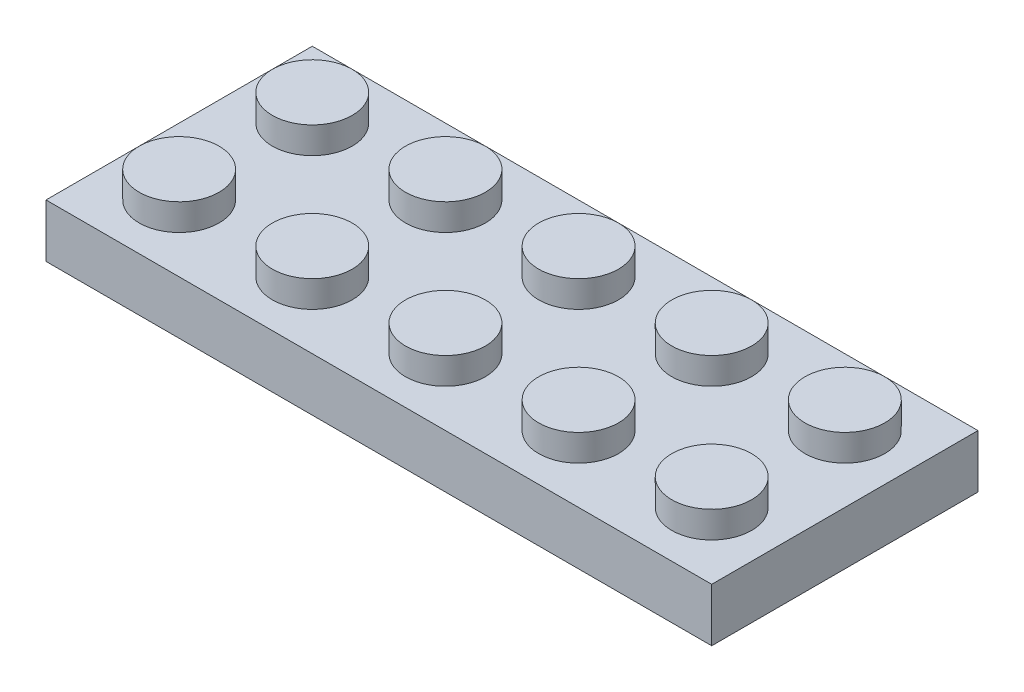
ISO-10303-21;
HEADER;
FILE_DESCRIPTION(('STEP AP214'),'2;1');
FILE_NAME('part.step','',(''),(''),'','','');
FILE_SCHEMA(('AUTOMOTIVE_DESIGN { 1 0 10303 214 1 1 1 1 }'));
ENDSEC;
DATA;
#1=APPLICATION_CONTEXT('core data for automotive mechanical design processes');
#2=APPLICATION_PROTOCOL_DEFINITION('international standard','automotive_design',2000,#1);
#3=PRODUCT_CONTEXT('',#1,'mechanical');
#4=PRODUCT('Part','Part','',(#3));
#5=PRODUCT_RELATED_PRODUCT_CATEGORY('part','',(#4));
#6=PRODUCT_DEFINITION_FORMATION('','',#4);
#7=PRODUCT_DEFINITION_CONTEXT('part definition',#1,'design');
#8=PRODUCT_DEFINITION('design','',#6,#7);
#9=PRODUCT_DEFINITION_SHAPE('','',#8);
#10=(LENGTH_UNIT() NAMED_UNIT(*) SI_UNIT(.MILLI.,.METRE.));
#11=(NAMED_UNIT(*) PLANE_ANGLE_UNIT() SI_UNIT($,.RADIAN.));
#12=(NAMED_UNIT(*) SI_UNIT($,.STERADIAN.) SOLID_ANGLE_UNIT());
#13=UNCERTAINTY_MEASURE_WITH_UNIT(LENGTH_MEASURE(1.E-05),#10,'distance_accuracy_value','');
#14=(GEOMETRIC_REPRESENTATION_CONTEXT(3) GLOBAL_UNCERTAINTY_ASSIGNED_CONTEXT((#13)) GLOBAL_UNIT_ASSIGNED_CONTEXT((#10,
#11,#12)) REPRESENTATION_CONTEXT('',''));
#15=CARTESIAN_POINT('',(0.,0.,0.));
#16=DIRECTION('',(0.,0.,1.));
#17=DIRECTION('',(1.,0.,0.));
#18=AXIS2_PLACEMENT_3D('',#15,#16,#17);
#19=CARTESIAN_POINT('',(36.,1.6,4.));
#20=DIRECTION('',(-1.,0.,0.));
#21=DIRECTION('',(0.,0.,1.));
#22=AXIS2_PLACEMENT_3D('',#19,#20,#21);
#23=PLANE('',#22);
#24=DIRECTION('',(0.,0.,-1.));
#25=VECTOR('',#24,1.);
#26=CARTESIAN_POINT('',(36.,0.,4.));
#27=LINE('',#26,#25);
#28=CARTESIAN_POINT('',(36.,0.,12.));
#29=VERTEX_POINT('',#28);
#30=CARTESIAN_POINT('',(36.,0.,-4.));
#31=VERTEX_POINT('',#30);
#32=EDGE_CURVE('E189',#29,#31,#27,.T.);
#33=ORIENTED_EDGE('',*,*,#32,.T.);
#34=DIRECTION('',(0.,-1.,0.));
#35=VECTOR('',#34,1.);
#36=CARTESIAN_POINT('',(36.,1.6,-4.));
#37=LINE('',#36,#35);
#38=CARTESIAN_POINT('',(36.,3.2,-4.));
#39=VERTEX_POINT('',#38);
#40=EDGE_CURVE('E243',#39,#31,#37,.T.);
#41=ORIENTED_EDGE('',*,*,#40,.F.);
#42=DIRECTION('',(0.,0.,-1.));
#43=VECTOR('',#42,1.);
#44=CARTESIAN_POINT('',(36.,3.2,4.));
#45=LINE('',#44,#43);
#46=CARTESIAN_POINT('',(36.,3.2,12.));
#47=VERTEX_POINT('',#46);
#48=EDGE_CURVE('E11',#47,#39,#45,.T.);
#49=ORIENTED_EDGE('',*,*,#48,.F.);
#50=DIRECTION('',(0.,1.,0.));
#51=VECTOR('',#50,1.);
#52=CARTESIAN_POINT('',(36.,1.6,12.));
#53=LINE('',#52,#51);
#54=EDGE_CURVE('E237',#29,#47,#53,.T.);
#55=ORIENTED_EDGE('',*,*,#54,.F.);
#56=EDGE_LOOP('',(#33,#41,#49,#55));
#57=FACE_BOUND('',#56,.T.);
#58=ADVANCED_FACE('F17',(#57),#23,.F.);
#59=CARTESIAN_POINT('',(16.,3.2,4.));
#60=DIRECTION('',(0.,-1.,0.));
#61=DIRECTION('',(0.,0.,-1.));
#62=AXIS2_PLACEMENT_3D('',#59,#60,#61);
#63=PLANE('',#62);
#64=ORIENTED_EDGE('',*,*,#48,.T.);
#65=DIRECTION('',(1.,0.,0.));
#66=VECTOR('',#65,1.);
#67=CARTESIAN_POINT('',(16.,3.2,-4.));
#68=LINE('',#67,#66);
#69=CARTESIAN_POINT('',(-4.,3.2,-4.));
#70=VERTEX_POINT('',#69);
#71=EDGE_CURVE('E190',#70,#39,#68,.T.);
#72=ORIENTED_EDGE('',*,*,#71,.F.);
#73=DIRECTION('',(0.,0.,-1.));
#74=VECTOR('',#73,1.);
#75=CARTESIAN_POINT('',(-4.,3.2,4.));
#76=LINE('',#75,#74);
#77=CARTESIAN_POINT('',(-4.,3.2,12.));
#78=VERTEX_POINT('',#77);
#79=EDGE_CURVE('E27',#78,#70,#76,.T.);
#80=ORIENTED_EDGE('',*,*,#79,.F.);
#81=DIRECTION('',(-1.,0.,0.));
#82=VECTOR('',#81,1.);
#83=CARTESIAN_POINT('',(16.,3.2,12.));
#84=LINE('',#83,#82);
#85=EDGE_CURVE('E275',#47,#78,#84,.T.);
#86=ORIENTED_EDGE('',*,*,#85,.F.);
#87=EDGE_LOOP('',(#64,#72,#80,#86));
#88=FACE_BOUND('',#87,.T.);
#89=CARTESIAN_POINT('',(0.,3.2,0.));
#90=DIRECTION('',(0.,-1.,0.));
#91=DIRECTION('',(1.,0.,0.));
#92=AXIS2_PLACEMENT_3D('',#89,#90,#91);
#93=CIRCLE('',#92,2.4);
#94=CARTESIAN_POINT('',(-2.4,3.2,0.));
#95=VERTEX_POINT('',#94);
#96=EDGE_CURVE('E185',#95,#95,#93,.T.);
#97=ORIENTED_EDGE('',*,*,#96,.T.);
#98=EDGE_LOOP('',(#97));
#99=FACE_BOUND('',#98,.T.);
#100=CARTESIAN_POINT('',(0.,3.2,8.));
#101=DIRECTION('',(0.,-1.,0.));
#102=DIRECTION('',(1.,0.,0.));
#103=AXIS2_PLACEMENT_3D('',#100,#101,#102);
#104=CIRCLE('',#103,2.4);
#105=CARTESIAN_POINT('',(-2.4,3.2,8.));
#106=VERTEX_POINT('',#105);
#107=EDGE_CURVE('E186',#106,#106,#104,.T.);
#108=ORIENTED_EDGE('',*,*,#107,.T.);
#109=EDGE_LOOP('',(#108));
#110=FACE_BOUND('',#109,.T.);
#111=CARTESIAN_POINT('',(8.,3.2,0.));
#112=DIRECTION('',(0.,-1.,0.));
#113=DIRECTION('',(1.,0.,0.));
#114=AXIS2_PLACEMENT_3D('',#111,#112,#113);
#115=CIRCLE('',#114,2.4);
#116=CARTESIAN_POINT('',(5.6,3.2,0.));
#117=VERTEX_POINT('',#116);
#118=EDGE_CURVE('E221',#117,#117,#115,.T.);
#119=ORIENTED_EDGE('',*,*,#118,.T.);
#120=EDGE_LOOP('',(#119));
#121=FACE_BOUND('',#120,.T.);
#122=CARTESIAN_POINT('',(8.,3.2,8.));
#123=DIRECTION('',(0.,-1.,0.));
#124=DIRECTION('',(1.,0.,0.));
#125=AXIS2_PLACEMENT_3D('',#122,#123,#124);
#126=CIRCLE('',#125,2.4);
#127=CARTESIAN_POINT('',(5.6,3.2,8.));
#128=VERTEX_POINT('',#127);
#129=EDGE_CURVE('E227',#128,#128,#126,.T.);
#130=ORIENTED_EDGE('',*,*,#129,.T.);
#131=EDGE_LOOP('',(#130));
#132=FACE_BOUND('',#131,.T.);
#133=CARTESIAN_POINT('',(16.,3.2,0.));
#134=DIRECTION('',(0.,-1.,0.));
#135=DIRECTION('',(1.,0.,0.));
#136=AXIS2_PLACEMENT_3D('',#133,#134,#135);
#137=CIRCLE('',#136,2.4);
#138=CARTESIAN_POINT('',(13.6,3.2,0.));
#139=VERTEX_POINT('',#138);
#140=EDGE_CURVE('E171',#139,#139,#137,.T.);
#141=ORIENTED_EDGE('',*,*,#140,.T.);
#142=EDGE_LOOP('',(#141));
#143=FACE_BOUND('',#142,.T.);
#144=CARTESIAN_POINT('',(16.,3.2,8.));
#145=DIRECTION('',(0.,-1.,0.));
#146=DIRECTION('',(1.,0.,0.));
#147=AXIS2_PLACEMENT_3D('',#144,#145,#146);
#148=CIRCLE('',#147,2.4);
#149=CARTESIAN_POINT('',(13.6,3.2,8.));
#150=VERTEX_POINT('',#149);
#151=EDGE_CURVE('E164',#150,#150,#148,.T.);
#152=ORIENTED_EDGE('',*,*,#151,.T.);
#153=EDGE_LOOP('',(#152));
#154=FACE_BOUND('',#153,.T.);
#155=CARTESIAN_POINT('',(24.,3.2,0.));
#156=DIRECTION('',(0.,-1.,0.));
#157=DIRECTION('',(1.,0.,0.));
#158=AXIS2_PLACEMENT_3D('',#155,#156,#157);
#159=CIRCLE('',#158,2.4);
#160=CARTESIAN_POINT('',(21.6,3.2,0.));
#161=VERTEX_POINT('',#160);
#162=EDGE_CURVE('E173',#161,#161,#159,.T.);
#163=ORIENTED_EDGE('',*,*,#162,.T.);
#164=EDGE_LOOP('',(#163));
#165=FACE_BOUND('',#164,.T.);
#166=CARTESIAN_POINT('',(24.,3.2,8.));
#167=DIRECTION('',(0.,-1.,0.));
#168=DIRECTION('',(1.,0.,0.));
#169=AXIS2_PLACEMENT_3D('',#166,#167,#168);
#170=CIRCLE('',#169,2.4);
#171=CARTESIAN_POINT('',(21.6,3.2,8.));
#172=VERTEX_POINT('',#171);
#173=EDGE_CURVE('E249',#172,#172,#170,.T.);
#174=ORIENTED_EDGE('',*,*,#173,.T.);
#175=EDGE_LOOP('',(#174));
#176=FACE_BOUND('',#175,.T.);
#177=CARTESIAN_POINT('',(32.,3.2,0.));
#178=DIRECTION('',(0.,-1.,0.));
#179=DIRECTION('',(1.,0.,0.));
#180=AXIS2_PLACEMENT_3D('',#177,#178,#179);
#181=CIRCLE('',#180,2.4);
#182=CARTESIAN_POINT('',(29.6,3.2,0.));
#183=VERTEX_POINT('',#182);
#184=EDGE_CURVE('E292',#183,#183,#181,.T.);
#185=ORIENTED_EDGE('',*,*,#184,.T.);
#186=EDGE_LOOP('',(#185));
#187=FACE_BOUND('',#186,.T.);
#188=CARTESIAN_POINT('',(32.,3.2,8.));
#189=DIRECTION('',(0.,-1.,0.));
#190=DIRECTION('',(1.,0.,0.));
#191=AXIS2_PLACEMENT_3D('',#188,#189,#190);
#192=CIRCLE('',#191,2.4);
#193=CARTESIAN_POINT('',(29.6,3.2,8.));
#194=VERTEX_POINT('',#193);
#195=EDGE_CURVE('E201',#194,#194,#192,.T.);
#196=ORIENTED_EDGE('',*,*,#195,.T.);
#197=EDGE_LOOP('',(#196));
#198=FACE_BOUND('',#197,.T.);
#199=ADVANCED_FACE('F165',(#88,#99,#110,#121,#132,#143,#154,#165,#176,#187,#198),#63,.F.);
#200=CARTESIAN_POINT('',(-4.,1.6,4.));
#201=DIRECTION('',(1.,0.,0.));
#202=DIRECTION('',(0.,0.,-1.));
#203=AXIS2_PLACEMENT_3D('',#200,#201,#202);
#204=PLANE('',#203);
#205=ORIENTED_EDGE('',*,*,#79,.T.);
#206=DIRECTION('',(0.,1.,0.));
#207=VECTOR('',#206,1.);
#208=CARTESIAN_POINT('',(-4.,1.6,-4.));
#209=LINE('',#208,#207);
#210=CARTESIAN_POINT('',(-4.,0.,-4.));
#211=VERTEX_POINT('',#210);
#212=EDGE_CURVE('E208',#211,#70,#209,.T.);
#213=ORIENTED_EDGE('',*,*,#212,.F.);
#214=DIRECTION('',(0.,0.,-1.));
#215=VECTOR('',#214,1.);
#216=CARTESIAN_POINT('',(-4.,0.,4.));
#217=LINE('',#216,#215);
#218=CARTESIAN_POINT('',(-4.,0.,12.));
#219=VERTEX_POINT('',#218);
#220=EDGE_CURVE('E187',#219,#211,#217,.T.);
#221=ORIENTED_EDGE('',*,*,#220,.F.);
#222=DIRECTION('',(0.,-1.,0.));
#223=VECTOR('',#222,1.);
#224=CARTESIAN_POINT('',(-4.,1.6,12.));
#225=LINE('',#224,#223);
#226=EDGE_CURVE('E248',#78,#219,#225,.T.);
#227=ORIENTED_EDGE('',*,*,#226,.F.);
#228=EDGE_LOOP('',(#205,#213,#221,#227));
#229=FACE_BOUND('',#228,.T.);
#230=ADVANCED_FACE('F339',(#229),#204,.F.);
#231=CARTESIAN_POINT('',(16.,0.,4.));
#232=DIRECTION('',(0.,1.,0.));
#233=DIRECTION('',(0.,0.,1.));
#234=AXIS2_PLACEMENT_3D('',#231,#232,#233);
#235=PLANE('',#234);
#236=ORIENTED_EDGE('',*,*,#220,.T.);
#237=DIRECTION('',(-1.,0.,0.));
#238=VECTOR('',#237,1.);
#239=CARTESIAN_POINT('',(16.,0.,-4.));
#240=LINE('',#239,#238);
#241=EDGE_CURVE('E240',#31,#211,#240,.T.);
#242=ORIENTED_EDGE('',*,*,#241,.F.);
#243=ORIENTED_EDGE('',*,*,#32,.F.);
#244=DIRECTION('',(1.,0.,0.));
#245=VECTOR('',#244,1.);
#246=CARTESIAN_POINT('',(16.,0.,12.));
#247=LINE('',#246,#245);
#248=EDGE_CURVE('E245',#219,#29,#247,.T.);
#249=ORIENTED_EDGE('',*,*,#248,.F.);
#250=EDGE_LOOP('',(#236,#242,#243,#249));
#251=FACE_BOUND('',#250,.T.);
#252=CARTESIAN_POINT('',(0.,0.,0.));
#253=DIRECTION('',(0.,1.,0.));
#254=DIRECTION('',(1.,0.,0.));
#255=AXIS2_PLACEMENT_3D('',#252,#253,#254);
#256=CIRCLE('',#255,2.4);
#257=CARTESIAN_POINT('',(-2.4,0.,0.));
#258=VERTEX_POINT('',#257);
#259=EDGE_CURVE('E256',#258,#258,#256,.T.);
#260=ORIENTED_EDGE('',*,*,#259,.T.);
#261=EDGE_LOOP('',(#260));
#262=FACE_BOUND('',#261,.T.);
#263=CARTESIAN_POINT('',(0.,0.,8.));
#264=DIRECTION('',(0.,1.,0.));
#265=DIRECTION('',(1.,0.,0.));
#266=AXIS2_PLACEMENT_3D('',#263,#264,#265);
#267=CIRCLE('',#266,2.4);
#268=CARTESIAN_POINT('',(-2.4,0.,8.));
#269=VERTEX_POINT('',#268);
#270=EDGE_CURVE('E257',#269,#269,#267,.T.);
#271=ORIENTED_EDGE('',*,*,#270,.T.);
#272=EDGE_LOOP('',(#271));
#273=FACE_BOUND('',#272,.T.);
#274=CARTESIAN_POINT('',(8.,0.,0.));
#275=DIRECTION('',(0.,1.,0.));
#276=DIRECTION('',(1.,0.,0.));
#277=AXIS2_PLACEMENT_3D('',#274,#275,#276);
#278=CIRCLE('',#277,2.4);
#279=CARTESIAN_POINT('',(5.6,0.,0.));
#280=VERTEX_POINT('',#279);
#281=EDGE_CURVE('E269',#280,#280,#278,.T.);
#282=ORIENTED_EDGE('',*,*,#281,.T.);
#283=EDGE_LOOP('',(#282));
#284=FACE_BOUND('',#283,.T.);
#285=CARTESIAN_POINT('',(8.,0.,8.));
#286=DIRECTION('',(0.,1.,0.));
#287=DIRECTION('',(1.,0.,0.));
#288=AXIS2_PLACEMENT_3D('',#285,#286,#287);
#289=CIRCLE('',#288,2.4);
#290=CARTESIAN_POINT('',(5.6,0.,8.));
#291=VERTEX_POINT('',#290);
#292=EDGE_CURVE('E270',#291,#291,#289,.T.);
#293=ORIENTED_EDGE('',*,*,#292,.T.);
#294=EDGE_LOOP('',(#293));
#295=FACE_BOUND('',#294,.T.);
#296=CARTESIAN_POINT('',(16.,0.,0.));
#297=DIRECTION('',(0.,1.,0.));
#298=DIRECTION('',(1.,0.,0.));
#299=AXIS2_PLACEMENT_3D('',#296,#297,#298);
#300=CIRCLE('',#299,2.4);
#301=CARTESIAN_POINT('',(13.6,0.,0.));
#302=VERTEX_POINT('',#301);
#303=EDGE_CURVE('E219',#302,#302,#300,.T.);
#304=ORIENTED_EDGE('',*,*,#303,.T.);
#305=EDGE_LOOP('',(#304));
#306=FACE_BOUND('',#305,.T.);
#307=CARTESIAN_POINT('',(16.,0.,8.));
#308=DIRECTION('',(0.,1.,0.));
#309=DIRECTION('',(1.,0.,0.));
#310=AXIS2_PLACEMENT_3D('',#307,#308,#309);
#311=CIRCLE('',#310,2.4);
#312=CARTESIAN_POINT('',(13.6,0.,8.));
#313=VERTEX_POINT('',#312);
#314=EDGE_CURVE('E220',#313,#313,#311,.T.);
#315=ORIENTED_EDGE('',*,*,#314,.T.);
#316=EDGE_LOOP('',(#315));
#317=FACE_BOUND('',#316,.T.);
#318=CARTESIAN_POINT('',(24.,0.,0.));
#319=DIRECTION('',(0.,1.,0.));
#320=DIRECTION('',(1.,0.,0.));
#321=AXIS2_PLACEMENT_3D('',#318,#319,#320);
#322=CIRCLE('',#321,2.4);
#323=CARTESIAN_POINT('',(21.6,0.,0.));
#324=VERTEX_POINT('',#323);
#325=EDGE_CURVE('E197',#324,#324,#322,.T.);
#326=ORIENTED_EDGE('',*,*,#325,.T.);
#327=EDGE_LOOP('',(#326));
#328=FACE_BOUND('',#327,.T.);
#329=CARTESIAN_POINT('',(24.,0.,8.));
#330=DIRECTION('',(0.,1.,0.));
#331=DIRECTION('',(1.,0.,0.));
#332=AXIS2_PLACEMENT_3D('',#329,#330,#331);
#333=CIRCLE('',#332,2.4);
#334=CARTESIAN_POINT('',(21.6,0.,8.));
#335=VERTEX_POINT('',#334);
#336=EDGE_CURVE('E198',#335,#335,#333,.T.);
#337=ORIENTED_EDGE('',*,*,#336,.T.);
#338=EDGE_LOOP('',(#337));
#339=FACE_BOUND('',#338,.T.);
#340=CARTESIAN_POINT('',(32.,0.,0.));
#341=DIRECTION('',(0.,1.,0.));
#342=DIRECTION('',(1.,0.,0.));
#343=AXIS2_PLACEMENT_3D('',#340,#341,#342);
#344=CIRCLE('',#343,2.4);
#345=CARTESIAN_POINT('',(29.6,0.,0.));
#346=VERTEX_POINT('',#345);
#347=EDGE_CURVE('E279',#346,#346,#344,.T.);
#348=ORIENTED_EDGE('',*,*,#347,.T.);
#349=EDGE_LOOP('',(#348));
#350=FACE_BOUND('',#349,.T.);
#351=CARTESIAN_POINT('',(32.,0.,8.));
#352=DIRECTION('',(0.,1.,0.));
#353=DIRECTION('',(1.,0.,0.));
#354=AXIS2_PLACEMENT_3D('',#351,#352,#353);
#355=CIRCLE('',#354,2.4);
#356=CARTESIAN_POINT('',(29.6,0.,8.));
#357=VERTEX_POINT('',#356);
#358=EDGE_CURVE('E193',#357,#357,#355,.T.);
#359=ORIENTED_EDGE('',*,*,#358,.T.);
#360=EDGE_LOOP('',(#359));
#361=FACE_BOUND('',#360,.T.);
#362=CARTESIAN_POINT('',(4.,0.,4.));
#363=DIRECTION('',(0.,1.,0.));
#364=DIRECTION('',(1.,0.,0.));
#365=AXIS2_PLACEMENT_3D('',#362,#363,#364);
#366=CIRCLE('',#365,2.4);
#367=CARTESIAN_POINT('',(1.6,0.,4.));
#368=VERTEX_POINT('',#367);
#369=EDGE_CURVE('E194',#368,#368,#366,.T.);
#370=ORIENTED_EDGE('',*,*,#369,.T.);
#371=EDGE_LOOP('',(#370));
#372=FACE_BOUND('',#371,.T.);
#373=CARTESIAN_POINT('',(12.,0.,4.));
#374=DIRECTION('',(0.,1.,0.));
#375=DIRECTION('',(1.,0.,0.));
#376=AXIS2_PLACEMENT_3D('',#373,#374,#375);
#377=CIRCLE('',#376,2.4);
#378=CARTESIAN_POINT('',(9.6,0.,4.));
#379=VERTEX_POINT('',#378);
#380=EDGE_CURVE('E181',#379,#379,#377,.T.);
#381=ORIENTED_EDGE('',*,*,#380,.T.);
#382=EDGE_LOOP('',(#381));
#383=FACE_BOUND('',#382,.T.);
#384=CARTESIAN_POINT('',(20.,0.,4.));
#385=DIRECTION('',(0.,1.,0.));
#386=DIRECTION('',(1.,0.,0.));
#387=AXIS2_PLACEMENT_3D('',#384,#385,#386);
#388=CIRCLE('',#387,2.4);
#389=CARTESIAN_POINT('',(17.6,0.,4.));
#390=VERTEX_POINT('',#389);
#391=EDGE_CURVE('E182',#390,#390,#388,.T.);
#392=ORIENTED_EDGE('',*,*,#391,.T.);
#393=EDGE_LOOP('',(#392));
#394=FACE_BOUND('',#393,.T.);
#395=CARTESIAN_POINT('',(28.,0.,4.));
#396=DIRECTION('',(0.,1.,0.));
#397=DIRECTION('',(1.,0.,0.));
#398=AXIS2_PLACEMENT_3D('',#395,#396,#397);
#399=CIRCLE('',#398,2.4);
#400=CARTESIAN_POINT('',(25.6,0.,4.));
#401=VERTEX_POINT('',#400);
#402=EDGE_CURVE('E205',#401,#401,#399,.T.);
#403=ORIENTED_EDGE('',*,*,#402,.T.);
#404=EDGE_LOOP('',(#403));
#405=FACE_BOUND('',#404,.T.);
#406=ADVANCED_FACE('F389',(#251,#262,#273,#284,#295,#306,#317,#328,#339,#350,#361,#372,#383,
#394,#405),#235,.F.);
#407=CARTESIAN_POINT('',(16.,1.6,-4.));
#408=DIRECTION('',(0.,0.,1.));
#409=DIRECTION('',(1.,0.,0.));
#410=AXIS2_PLACEMENT_3D('',#407,#408,#409);
#411=PLANE('',#410);
#412=ORIENTED_EDGE('',*,*,#40,.T.);
#413=ORIENTED_EDGE('',*,*,#241,.T.);
#414=ORIENTED_EDGE('',*,*,#212,.T.);
#415=ORIENTED_EDGE('',*,*,#71,.T.);
#416=EDGE_LOOP('',(#412,#413,#414,#415));
#417=FACE_BOUND('',#416,.T.);
#418=ADVANCED_FACE('F344',(#417),#411,.F.);
#419=CARTESIAN_POINT('',(16.,1.6,12.));
#420=DIRECTION('',(0.,0.,1.));
#421=DIRECTION('',(1.,0.,0.));
#422=AXIS2_PLACEMENT_3D('',#419,#420,#421);
#423=PLANE('',#422);
#424=ORIENTED_EDGE('',*,*,#54,.T.);
#425=ORIENTED_EDGE('',*,*,#85,.T.);
#426=ORIENTED_EDGE('',*,*,#226,.T.);
#427=ORIENTED_EDGE('',*,*,#248,.T.);
#428=EDGE_LOOP('',(#424,#425,#426,#427));
#429=FACE_BOUND('',#428,.T.);
#430=ADVANCED_FACE('F527',(#429),#423,.T.);
#431=CARTESIAN_POINT('',(0.,4.8,0.));
#432=DIRECTION('',(0.,1.,0.));
#433=DIRECTION('',(1.,0.,0.));
#434=AXIS2_PLACEMENT_3D('',#431,#432,#433);
#435=PLANE('',#434);
#436=CARTESIAN_POINT('',(0.,4.8,0.));
#437=DIRECTION('',(0.,1.,0.));
#438=DIRECTION('',(1.,0.,0.));
#439=AXIS2_PLACEMENT_3D('',#436,#437,#438);
#440=CIRCLE('',#439,2.4);
#441=CARTESIAN_POINT('',(2.4,4.8,0.));
#442=VERTEX_POINT('',#441);
#443=EDGE_CURVE('E183',#442,#442,#440,.T.);
#444=ORIENTED_EDGE('',*,*,#443,.T.);
#445=EDGE_LOOP('',(#444));
#446=FACE_BOUND('',#445,.T.);
#447=ADVANCED_FACE('F524',(#446),#435,.T.);
#448=CARTESIAN_POINT('',(0.,3.75,0.));
#449=DIRECTION('',(0.,-1.,0.));
#450=DIRECTION('',(1.,0.,0.));
#451=AXIS2_PLACEMENT_3D('',#448,#449,#450);
#452=CYLINDRICAL_SURFACE('',#451,2.4);
#453=ORIENTED_EDGE('',*,*,#96,.F.);
#454=EDGE_LOOP('',(#453));
#455=FACE_BOUND('',#454,.T.);
#456=ORIENTED_EDGE('',*,*,#443,.F.);
#457=EDGE_LOOP('',(#456));
#458=FACE_BOUND('',#457,.T.);
#459=ADVANCED_FACE('F328',(#455,#458),#452,.T.);
#460=CARTESIAN_POINT('',(0.,4.8,8.));
#461=DIRECTION('',(0.,1.,0.));
#462=DIRECTION('',(1.,0.,0.));
#463=AXIS2_PLACEMENT_3D('',#460,#461,#462);
#464=PLANE('',#463);
#465=CARTESIAN_POINT('',(0.,4.8,8.));
#466=DIRECTION('',(0.,1.,0.));
#467=DIRECTION('',(1.,0.,0.));
#468=AXIS2_PLACEMENT_3D('',#465,#466,#467);
#469=CIRCLE('',#468,2.4);
#470=CARTESIAN_POINT('',(2.4,4.8,8.));
#471=VERTEX_POINT('',#470);
#472=EDGE_CURVE('E210',#471,#471,#469,.T.);
#473=ORIENTED_EDGE('',*,*,#472,.T.);
#474=EDGE_LOOP('',(#473));
#475=FACE_BOUND('',#474,.T.);
#476=ADVANCED_FACE('F314',(#475),#464,.T.);
#477=CARTESIAN_POINT('',(0.,3.75,8.));
#478=DIRECTION('',(0.,-1.,0.));
#479=DIRECTION('',(1.,0.,0.));
#480=AXIS2_PLACEMENT_3D('',#477,#478,#479);
#481=CYLINDRICAL_SURFACE('',#480,2.4);
#482=ORIENTED_EDGE('',*,*,#107,.F.);
#483=EDGE_LOOP('',(#482));
#484=FACE_BOUND('',#483,.T.);
#485=ORIENTED_EDGE('',*,*,#472,.F.);
#486=EDGE_LOOP('',(#485));
#487=FACE_BOUND('',#486,.T.);
#488=ADVANCED_FACE('F316',(#484,#487),#481,.T.);
#489=CARTESIAN_POINT('',(8.,4.8,0.));
#490=DIRECTION('',(0.,1.,0.));
#491=DIRECTION('',(1.,0.,0.));
#492=AXIS2_PLACEMENT_3D('',#489,#490,#491);
#493=PLANE('',#492);
#494=CARTESIAN_POINT('',(8.,4.8,0.));
#495=DIRECTION('',(0.,1.,0.));
#496=DIRECTION('',(1.,0.,0.));
#497=AXIS2_PLACEMENT_3D('',#494,#495,#496);
#498=CIRCLE('',#497,2.4);
#499=CARTESIAN_POINT('',(10.4,4.8,0.));
#500=VERTEX_POINT('',#499);
#501=EDGE_CURVE('E223',#500,#500,#498,.T.);
#502=ORIENTED_EDGE('',*,*,#501,.T.);
#503=EDGE_LOOP('',(#502));
#504=FACE_BOUND('',#503,.T.);
#505=ADVANCED_FACE('F318',(#504),#493,.T.);
#506=CARTESIAN_POINT('',(8.,3.75,0.));
#507=DIRECTION('',(0.,-1.,0.));
#508=DIRECTION('',(1.,0.,0.));
#509=AXIS2_PLACEMENT_3D('',#506,#507,#508);
#510=CYLINDRICAL_SURFACE('',#509,2.4);
#511=ORIENTED_EDGE('',*,*,#118,.F.);
#512=EDGE_LOOP('',(#511));
#513=FACE_BOUND('',#512,.T.);
#514=ORIENTED_EDGE('',*,*,#501,.F.);
#515=EDGE_LOOP('',(#514));
#516=FACE_BOUND('',#515,.T.);
#517=ADVANCED_FACE('F326',(#513,#516),#510,.T.);
#518=CARTESIAN_POINT('',(8.,4.8,8.));
#519=DIRECTION('',(0.,1.,0.));
#520=DIRECTION('',(1.,0.,0.));
#521=AXIS2_PLACEMENT_3D('',#518,#519,#520);
#522=PLANE('',#521);
#523=CARTESIAN_POINT('',(8.,4.8,8.));
#524=DIRECTION('',(0.,1.,0.));
#525=DIRECTION('',(1.,0.,0.));
#526=AXIS2_PLACEMENT_3D('',#523,#524,#525);
#527=CIRCLE('',#526,2.4);
#528=CARTESIAN_POINT('',(10.4,4.8,8.));
#529=VERTEX_POINT('',#528);
#530=EDGE_CURVE('E230',#529,#529,#527,.T.);
#531=ORIENTED_EDGE('',*,*,#530,.T.);
#532=EDGE_LOOP('',(#531));
#533=FACE_BOUND('',#532,.T.);
#534=ADVANCED_FACE('F366',(#533),#522,.T.);
#535=CARTESIAN_POINT('',(8.,3.75,8.));
#536=DIRECTION('',(0.,-1.,0.));
#537=DIRECTION('',(1.,0.,0.));
#538=AXIS2_PLACEMENT_3D('',#535,#536,#537);
#539=CYLINDRICAL_SURFACE('',#538,2.4);
#540=ORIENTED_EDGE('',*,*,#129,.F.);
#541=EDGE_LOOP('',(#540));
#542=FACE_BOUND('',#541,.T.);
#543=ORIENTED_EDGE('',*,*,#530,.F.);
#544=EDGE_LOOP('',(#543));
#545=FACE_BOUND('',#544,.T.);
#546=ADVANCED_FACE('F362',(#542,#545),#539,.T.);
#547=CARTESIAN_POINT('',(16.,4.8,0.));
#548=DIRECTION('',(0.,1.,0.));
#549=DIRECTION('',(1.,0.,0.));
#550=AXIS2_PLACEMENT_3D('',#547,#548,#549);
#551=PLANE('',#550);
#552=CARTESIAN_POINT('',(16.,4.8,0.));
#553=DIRECTION('',(0.,1.,0.));
#554=DIRECTION('',(1.,0.,0.));
#555=AXIS2_PLACEMENT_3D('',#552,#553,#554);
#556=CIRCLE('',#555,2.4);
#557=CARTESIAN_POINT('',(18.4,4.8,0.));
#558=VERTEX_POINT('',#557);
#559=EDGE_CURVE('E168',#558,#558,#556,.T.);
#560=ORIENTED_EDGE('',*,*,#559,.T.);
#561=EDGE_LOOP('',(#560));
#562=FACE_BOUND('',#561,.T.);
#563=ADVANCED_FACE('F365',(#562),#551,.T.);
#564=CARTESIAN_POINT('',(16.,3.75,0.));
#565=DIRECTION('',(0.,-1.,0.));
#566=DIRECTION('',(1.,0.,0.));
#567=AXIS2_PLACEMENT_3D('',#564,#565,#566);
#568=CYLINDRICAL_SURFACE('',#567,2.4);
#569=ORIENTED_EDGE('',*,*,#140,.F.);
#570=EDGE_LOOP('',(#569));
#571=FACE_BOUND('',#570,.T.);
#572=ORIENTED_EDGE('',*,*,#559,.F.);
#573=EDGE_LOOP('',(#572));
#574=FACE_BOUND('',#573,.T.);
#575=ADVANCED_FACE('F516',(#571,#574),#568,.T.);
#576=CARTESIAN_POINT('',(16.,4.8,8.));
#577=DIRECTION('',(0.,1.,0.));
#578=DIRECTION('',(1.,0.,0.));
#579=AXIS2_PLACEMENT_3D('',#576,#577,#578);
#580=PLANE('',#579);
#581=CARTESIAN_POINT('',(16.,4.8,8.));
#582=DIRECTION('',(0.,1.,0.));
#583=DIRECTION('',(1.,0.,0.));
#584=AXIS2_PLACEMENT_3D('',#581,#582,#583);
#585=CIRCLE('',#584,2.4);
#586=CARTESIAN_POINT('',(18.4,4.8,8.));
#587=VERTEX_POINT('',#586);
#588=EDGE_CURVE('E169',#587,#587,#585,.T.);
#589=ORIENTED_EDGE('',*,*,#588,.T.);
#590=EDGE_LOOP('',(#589));
#591=FACE_BOUND('',#590,.T.);
#592=ADVANCED_FACE('F19',(#591),#580,.T.);
#593=CARTESIAN_POINT('',(16.,3.75,8.));
#594=DIRECTION('',(0.,-1.,0.));
#595=DIRECTION('',(1.,0.,0.));
#596=AXIS2_PLACEMENT_3D('',#593,#594,#595);
#597=CYLINDRICAL_SURFACE('',#596,2.4);
#598=ORIENTED_EDGE('',*,*,#151,.F.);
#599=EDGE_LOOP('',(#598));
#600=FACE_BOUND('',#599,.T.);
#601=ORIENTED_EDGE('',*,*,#588,.F.);
#602=EDGE_LOOP('',(#601));
#603=FACE_BOUND('',#602,.T.);
#604=ADVANCED_FACE('F401',(#600,#603),#597,.T.);
#605=CARTESIAN_POINT('',(24.,4.8,0.));
#606=DIRECTION('',(0.,1.,0.));
#607=DIRECTION('',(1.,0.,0.));
#608=AXIS2_PLACEMENT_3D('',#605,#606,#607);
#609=PLANE('',#608);
#610=CARTESIAN_POINT('',(24.,4.8,0.));
#611=DIRECTION('',(0.,1.,0.));
#612=DIRECTION('',(1.,0.,0.));
#613=AXIS2_PLACEMENT_3D('',#610,#611,#612);
#614=CIRCLE('',#613,2.4);
#615=CARTESIAN_POINT('',(26.4,4.8,0.));
#616=VERTEX_POINT('',#615);
#617=EDGE_CURVE('E177',#616,#616,#614,.T.);
#618=ORIENTED_EDGE('',*,*,#617,.T.);
#619=EDGE_LOOP('',(#618));
#620=FACE_BOUND('',#619,.T.);
#621=ADVANCED_FACE('F387',(#620),#609,.T.);
#622=CARTESIAN_POINT('',(24.,3.75,0.));
#623=DIRECTION('',(0.,-1.,0.));
#624=DIRECTION('',(1.,0.,0.));
#625=AXIS2_PLACEMENT_3D('',#622,#623,#624);
#626=CYLINDRICAL_SURFACE('',#625,2.4);
#627=ORIENTED_EDGE('',*,*,#162,.F.);
#628=EDGE_LOOP('',(#627));
#629=FACE_BOUND('',#628,.T.);
#630=ORIENTED_EDGE('',*,*,#617,.F.);
#631=EDGE_LOOP('',(#630));
#632=FACE_BOUND('',#631,.T.);
#633=ADVANCED_FACE('F383',(#629,#632),#626,.T.);
#634=CARTESIAN_POINT('',(24.,4.8,8.));
#635=DIRECTION('',(0.,1.,0.));
#636=DIRECTION('',(1.,0.,0.));
#637=AXIS2_PLACEMENT_3D('',#634,#635,#636);
#638=PLANE('',#637);
#639=CARTESIAN_POINT('',(24.,4.8,8.));
#640=DIRECTION('',(0.,1.,0.));
#641=DIRECTION('',(1.,0.,0.));
#642=AXIS2_PLACEMENT_3D('',#639,#640,#641);
#643=CIRCLE('',#642,2.4);
#644=CARTESIAN_POINT('',(26.4,4.8,8.));
#645=VERTEX_POINT('',#644);
#646=EDGE_CURVE('E252',#645,#645,#643,.T.);
#647=ORIENTED_EDGE('',*,*,#646,.T.);
#648=EDGE_LOOP('',(#647));
#649=FACE_BOUND('',#648,.T.);
#650=ADVANCED_FACE('F386',(#649),#638,.T.);
#651=CARTESIAN_POINT('',(24.,3.75,8.));
#652=DIRECTION('',(0.,-1.,0.));
#653=DIRECTION('',(1.,0.,0.));
#654=AXIS2_PLACEMENT_3D('',#651,#652,#653);
#655=CYLINDRICAL_SURFACE('',#654,2.4);
#656=ORIENTED_EDGE('',*,*,#173,.F.);
#657=EDGE_LOOP('',(#656));
#658=FACE_BOUND('',#657,.T.);
#659=ORIENTED_EDGE('',*,*,#646,.F.);
#660=EDGE_LOOP('',(#659));
#661=FACE_BOUND('',#660,.T.);
#662=ADVANCED_FACE('F504',(#658,#661),#655,.T.);
#663=CARTESIAN_POINT('',(32.,4.8,0.));
#664=DIRECTION('',(0.,1.,0.));
#665=DIRECTION('',(1.,0.,0.));
#666=AXIS2_PLACEMENT_3D('',#663,#664,#665);
#667=PLANE('',#666);
#668=CARTESIAN_POINT('',(32.,4.8,0.));
#669=DIRECTION('',(0.,1.,0.));
#670=DIRECTION('',(1.,0.,0.));
#671=AXIS2_PLACEMENT_3D('',#668,#669,#670);
#672=CIRCLE('',#671,2.4);
#673=CARTESIAN_POINT('',(34.4,4.8,0.));
#674=VERTEX_POINT('',#673);
#675=EDGE_CURVE('E215',#674,#674,#672,.T.);
#676=ORIENTED_EDGE('',*,*,#675,.T.);
#677=EDGE_LOOP('',(#676));
#678=FACE_BOUND('',#677,.T.);
#679=ADVANCED_FACE('F412',(#678),#667,.T.);
#680=CARTESIAN_POINT('',(32.,3.75,0.));
#681=DIRECTION('',(0.,-1.,0.));
#682=DIRECTION('',(1.,0.,0.));
#683=AXIS2_PLACEMENT_3D('',#680,#681,#682);
#684=CYLINDRICAL_SURFACE('',#683,2.4);
#685=ORIENTED_EDGE('',*,*,#184,.F.);
#686=EDGE_LOOP('',(#685));
#687=FACE_BOUND('',#686,.T.);
#688=ORIENTED_EDGE('',*,*,#675,.F.);
#689=EDGE_LOOP('',(#688));
#690=FACE_BOUND('',#689,.T.);
#691=ADVANCED_FACE('F409',(#687,#690),#684,.T.);
#692=CARTESIAN_POINT('',(32.,4.8,8.));
#693=DIRECTION('',(0.,1.,0.));
#694=DIRECTION('',(1.,0.,0.));
#695=AXIS2_PLACEMENT_3D('',#692,#693,#694);
#696=PLANE('',#695);
#697=CARTESIAN_POINT('',(32.,4.8,8.));
#698=DIRECTION('',(0.,1.,0.));
#699=DIRECTION('',(1.,0.,0.));
#700=AXIS2_PLACEMENT_3D('',#697,#698,#699);
#701=CIRCLE('',#700,2.4);
#702=CARTESIAN_POINT('',(34.4,4.8,8.));
#703=VERTEX_POINT('',#702);
#704=EDGE_CURVE('E199',#703,#703,#701,.T.);
#705=ORIENTED_EDGE('',*,*,#704,.T.);
#706=EDGE_LOOP('',(#705));
#707=FACE_BOUND('',#706,.T.);
#708=ADVANCED_FACE('F350',(#707),#696,.T.);
#709=CARTESIAN_POINT('',(32.,3.75,8.));
#710=DIRECTION('',(0.,-1.,0.));
#711=DIRECTION('',(1.,0.,0.));
#712=AXIS2_PLACEMENT_3D('',#709,#710,#711);
#713=CYLINDRICAL_SURFACE('',#712,2.4);
#714=ORIENTED_EDGE('',*,*,#195,.F.);
#715=EDGE_LOOP('',(#714));
#716=FACE_BOUND('',#715,.T.);
#717=ORIENTED_EDGE('',*,*,#704,.F.);
#718=EDGE_LOOP('',(#717));
#719=FACE_BOUND('',#718,.T.);
#720=ADVANCED_FACE('F346',(#716,#719),#713,.T.);
#721=CARTESIAN_POINT('',(0.,1.6,0.));
#722=DIRECTION('',(0.,1.,0.));
#723=DIRECTION('',(1.,0.,0.));
#724=AXIS2_PLACEMENT_3D('',#721,#722,#723);
#725=PLANE('',#724);
#726=CARTESIAN_POINT('',(0.,1.6,0.));
#727=DIRECTION('',(0.,1.,0.));
#728=DIRECTION('',(1.,0.,0.));
#729=AXIS2_PLACEMENT_3D('',#726,#727,#728);
#730=CIRCLE('',#729,2.4);
#731=CARTESIAN_POINT('',(2.4,1.6,0.));
#732=VERTEX_POINT('',#731);
#733=EDGE_CURVE('E202',#732,#732,#730,.T.);
#734=ORIENTED_EDGE('',*,*,#733,.F.);
#735=EDGE_LOOP('',(#734));
#736=FACE_BOUND('',#735,.T.);
#737=ADVANCED_FACE('F349',(#736),#725,.F.);
#738=CARTESIAN_POINT('',(0.,0.55,0.));
#739=DIRECTION('',(0.,-1.,0.));
#740=DIRECTION('',(1.,0.,0.));
#741=AXIS2_PLACEMENT_3D('',#738,#739,#740);
#742=CYLINDRICAL_SURFACE('',#741,2.4);
#743=ORIENTED_EDGE('',*,*,#733,.T.);
#744=EDGE_LOOP('',(#743));
#745=FACE_BOUND('',#744,.T.);
#746=ORIENTED_EDGE('',*,*,#259,.F.);
#747=EDGE_LOOP('',(#746));
#748=FACE_BOUND('',#747,.T.);
#749=ADVANCED_FACE('F354',(#745,#748),#742,.F.);
#750=CARTESIAN_POINT('',(0.,1.6,8.));
#751=DIRECTION('',(0.,1.,0.));
#752=DIRECTION('',(1.,0.,0.));
#753=AXIS2_PLACEMENT_3D('',#750,#751,#752);
#754=PLANE('',#753);
#755=CARTESIAN_POINT('',(0.,1.6,8.));
#756=DIRECTION('',(0.,1.,0.));
#757=DIRECTION('',(1.,0.,0.));
#758=AXIS2_PLACEMENT_3D('',#755,#756,#757);
#759=CIRCLE('',#758,2.4);
#760=CARTESIAN_POINT('',(2.4,1.6,8.));
#761=VERTEX_POINT('',#760);
#762=EDGE_CURVE('E254',#761,#761,#759,.T.);
#763=ORIENTED_EDGE('',*,*,#762,.F.);
#764=EDGE_LOOP('',(#763));
#765=FACE_BOUND('',#764,.T.);
#766=ADVANCED_FACE('F378',(#765),#754,.F.);
#767=CARTESIAN_POINT('',(0.,0.55,8.));
#768=DIRECTION('',(0.,-1.,0.));
#769=DIRECTION('',(1.,0.,0.));
#770=AXIS2_PLACEMENT_3D('',#767,#768,#769);
#771=CYLINDRICAL_SURFACE('',#770,2.4);
#772=ORIENTED_EDGE('',*,*,#762,.T.);
#773=EDGE_LOOP('',(#772));
#774=FACE_BOUND('',#773,.T.);
#775=ORIENTED_EDGE('',*,*,#270,.F.);
#776=EDGE_LOOP('',(#775));
#777=FACE_BOUND('',#776,.T.);
#778=ADVANCED_FACE('F374',(#774,#777),#771,.F.);
#779=CARTESIAN_POINT('',(8.,1.6,0.));
#780=DIRECTION('',(0.,1.,0.));
#781=DIRECTION('',(1.,0.,0.));
#782=AXIS2_PLACEMENT_3D('',#779,#780,#781);
#783=PLANE('',#782);
#784=CARTESIAN_POINT('',(8.,1.6,0.));
#785=DIRECTION('',(0.,1.,0.));
#786=DIRECTION('',(1.,0.,0.));
#787=AXIS2_PLACEMENT_3D('',#784,#785,#786);
#788=CIRCLE('',#787,2.4);
#789=CARTESIAN_POINT('',(10.4,1.6,0.));
#790=VERTEX_POINT('',#789);
#791=EDGE_CURVE('E271',#790,#790,#788,.T.);
#792=ORIENTED_EDGE('',*,*,#791,.F.);
#793=EDGE_LOOP('',(#792));
#794=FACE_BOUND('',#793,.T.);
#795=ADVANCED_FACE('F377',(#794),#783,.F.);
#796=CARTESIAN_POINT('',(8.,0.55,0.));
#797=DIRECTION('',(0.,-1.,0.));
#798=DIRECTION('',(1.,0.,0.));
#799=AXIS2_PLACEMENT_3D('',#796,#797,#798);
#800=CYLINDRICAL_SURFACE('',#799,2.4);
#801=ORIENTED_EDGE('',*,*,#791,.T.);
#802=EDGE_LOOP('',(#801));
#803=FACE_BOUND('',#802,.T.);
#804=ORIENTED_EDGE('',*,*,#281,.F.);
#805=EDGE_LOOP('',(#804));
#806=FACE_BOUND('',#805,.T.);
#807=ADVANCED_FACE('F360',(#803,#806),#800,.F.);
#808=CARTESIAN_POINT('',(8.,1.6,8.));
#809=DIRECTION('',(0.,1.,0.));
#810=DIRECTION('',(1.,0.,0.));
#811=AXIS2_PLACEMENT_3D('',#808,#809,#810);
#812=PLANE('',#811);
#813=CARTESIAN_POINT('',(8.,1.6,8.));
#814=DIRECTION('',(0.,1.,0.));
#815=DIRECTION('',(1.,0.,0.));
#816=AXIS2_PLACEMENT_3D('',#813,#814,#815);
#817=CIRCLE('',#816,2.4);
#818=CARTESIAN_POINT('',(10.4,1.6,8.));
#819=VERTEX_POINT('',#818);
#820=EDGE_CURVE('E267',#819,#819,#817,.T.);
#821=ORIENTED_EDGE('',*,*,#820,.F.);
#822=EDGE_LOOP('',(#821));
#823=FACE_BOUND('',#822,.T.);
#824=ADVANCED_FACE('F356',(#823),#812,.F.);
#825=CARTESIAN_POINT('',(8.,0.55,8.));
#826=DIRECTION('',(0.,-1.,0.));
#827=DIRECTION('',(1.,0.,0.));
#828=AXIS2_PLACEMENT_3D('',#825,#826,#827);
#829=CYLINDRICAL_SURFACE('',#828,2.4);
#830=ORIENTED_EDGE('',*,*,#820,.T.);
#831=EDGE_LOOP('',(#830));
#832=FACE_BOUND('',#831,.T.);
#833=ORIENTED_EDGE('',*,*,#292,.F.);
#834=EDGE_LOOP('',(#833));
#835=FACE_BOUND('',#834,.T.);
#836=ADVANCED_FACE('F359',(#832,#835),#829,.F.);
#837=CARTESIAN_POINT('',(16.,1.6,0.));
#838=DIRECTION('',(0.,1.,0.));
#839=DIRECTION('',(1.,0.,0.));
#840=AXIS2_PLACEMENT_3D('',#837,#838,#839);
#841=PLANE('',#840);
#842=CARTESIAN_POINT('',(16.,1.6,0.));
#843=DIRECTION('',(0.,1.,0.));
#844=DIRECTION('',(1.,0.,0.));
#845=AXIS2_PLACEMENT_3D('',#842,#843,#844);
#846=CIRCLE('',#845,2.4);
#847=CARTESIAN_POINT('',(18.4,1.6,0.));
#848=VERTEX_POINT('',#847);
#849=EDGE_CURVE('E21',#848,#848,#846,.T.);
#850=ORIENTED_EDGE('',*,*,#849,.F.);
#851=EDGE_LOOP('',(#850));
#852=FACE_BOUND('',#851,.T.);
#853=ADVANCED_FACE('F407',(#852),#841,.F.);
#854=CARTESIAN_POINT('',(16.,0.55,0.));
#855=DIRECTION('',(0.,-1.,0.));
#856=DIRECTION('',(1.,0.,0.));
#857=AXIS2_PLACEMENT_3D('',#854,#855,#856);
#858=CYLINDRICAL_SURFACE('',#857,2.4);
#859=ORIENTED_EDGE('',*,*,#849,.T.);
#860=EDGE_LOOP('',(#859));
#861=FACE_BOUND('',#860,.T.);
#862=ORIENTED_EDGE('',*,*,#303,.F.);
#863=EDGE_LOOP('',(#862));
#864=FACE_BOUND('',#863,.T.);
#865=ADVANCED_FACE('F403',(#861,#864),#858,.F.);
#866=CARTESIAN_POINT('',(16.,1.6,8.));
#867=DIRECTION('',(0.,1.,0.));
#868=DIRECTION('',(1.,0.,0.));
#869=AXIS2_PLACEMENT_3D('',#866,#867,#868);
#870=PLANE('',#869);
#871=CARTESIAN_POINT('',(16.,1.6,8.));
#872=DIRECTION('',(0.,1.,0.));
#873=DIRECTION('',(1.,0.,0.));
#874=AXIS2_PLACEMENT_3D('',#871,#872,#873);
#875=CIRCLE('',#874,2.4);
#876=CARTESIAN_POINT('',(18.4,1.6,8.));
#877=VERTEX_POINT('',#876);
#878=EDGE_CURVE('E216',#877,#877,#875,.T.);
#879=ORIENTED_EDGE('',*,*,#878,.F.);
#880=EDGE_LOOP('',(#879));
#881=FACE_BOUND('',#880,.T.);
#882=ADVANCED_FACE('F406',(#881),#870,.F.);
#883=CARTESIAN_POINT('',(16.,0.55,8.));
#884=DIRECTION('',(0.,-1.,0.));
#885=DIRECTION('',(1.,0.,0.));
#886=AXIS2_PLACEMENT_3D('',#883,#884,#885);
#887=CYLINDRICAL_SURFACE('',#886,2.4);
#888=ORIENTED_EDGE('',*,*,#878,.T.);
#889=EDGE_LOOP('',(#888));
#890=FACE_BOUND('',#889,.T.);
#891=ORIENTED_EDGE('',*,*,#314,.F.);
#892=EDGE_LOOP('',(#891));
#893=FACE_BOUND('',#892,.T.);
#894=ADVANCED_FACE('F372',(#890,#893),#887,.F.);
#895=CARTESIAN_POINT('',(24.,1.6,0.));
#896=DIRECTION('',(0.,1.,0.));
#897=DIRECTION('',(1.,0.,0.));
#898=AXIS2_PLACEMENT_3D('',#895,#896,#897);
#899=PLANE('',#898);
#900=CARTESIAN_POINT('',(24.,1.6,0.));
#901=DIRECTION('',(0.,1.,0.));
#902=DIRECTION('',(1.,0.,0.));
#903=AXIS2_PLACEMENT_3D('',#900,#901,#902);
#904=CIRCLE('',#903,2.4);
#905=CARTESIAN_POINT('',(26.4,1.6,0.));
#906=VERTEX_POINT('',#905);
#907=EDGE_CURVE('E258',#906,#906,#904,.T.);
#908=ORIENTED_EDGE('',*,*,#907,.F.);
#909=EDGE_LOOP('',(#908));
#910=FACE_BOUND('',#909,.T.);
#911=ADVANCED_FACE('F368',(#910),#899,.F.);
#912=CARTESIAN_POINT('',(24.,0.55,0.));
#913=DIRECTION('',(0.,-1.,0.));
#914=DIRECTION('',(1.,0.,0.));
#915=AXIS2_PLACEMENT_3D('',#912,#913,#914);
#916=CYLINDRICAL_SURFACE('',#915,2.4);
#917=ORIENTED_EDGE('',*,*,#907,.T.);
#918=EDGE_LOOP('',(#917));
#919=FACE_BOUND('',#918,.T.);
#920=ORIENTED_EDGE('',*,*,#325,.F.);
#921=EDGE_LOOP('',(#920));
#922=FACE_BOUND('',#921,.T.);
#923=ADVANCED_FACE('F371',(#919,#922),#916,.F.);
#924=CARTESIAN_POINT('',(24.,1.6,8.));
#925=DIRECTION('',(0.,1.,0.));
#926=DIRECTION('',(1.,0.,0.));
#927=AXIS2_PLACEMENT_3D('',#924,#925,#926);
#928=PLANE('',#927);
#929=CARTESIAN_POINT('',(24.,1.6,8.));
#930=DIRECTION('',(0.,1.,0.));
#931=DIRECTION('',(1.,0.,0.));
#932=AXIS2_PLACEMENT_3D('',#929,#930,#931);
#933=CIRCLE('',#932,2.4);
#934=CARTESIAN_POINT('',(26.4,1.6,8.));
#935=VERTEX_POINT('',#934);
#936=EDGE_CURVE('E195',#935,#935,#933,.T.);
#937=ORIENTED_EDGE('',*,*,#936,.F.);
#938=EDGE_LOOP('',(#937));
#939=FACE_BOUND('',#938,.T.);
#940=ADVANCED_FACE('F546',(#939),#928,.F.);
#941=CARTESIAN_POINT('',(24.,0.55,8.));
#942=DIRECTION('',(0.,-1.,0.));
#943=DIRECTION('',(1.,0.,0.));
#944=AXIS2_PLACEMENT_3D('',#941,#942,#943);
#945=CYLINDRICAL_SURFACE('',#944,2.4);
#946=ORIENTED_EDGE('',*,*,#936,.T.);
#947=EDGE_LOOP('',(#946));
#948=FACE_BOUND('',#947,.T.);
#949=ORIENTED_EDGE('',*,*,#336,.F.);
#950=EDGE_LOOP('',(#949));
#951=FACE_BOUND('',#950,.T.);
#952=ADVANCED_FACE('F522',(#948,#951),#945,.F.);
#953=CARTESIAN_POINT('',(32.,1.6,0.));
#954=DIRECTION('',(0.,1.,0.));
#955=DIRECTION('',(1.,0.,0.));
#956=AXIS2_PLACEMENT_3D('',#953,#954,#955);
#957=PLANE('',#956);
#958=CARTESIAN_POINT('',(32.,1.6,0.));
#959=DIRECTION('',(0.,1.,0.));
#960=DIRECTION('',(1.,0.,0.));
#961=AXIS2_PLACEMENT_3D('',#958,#959,#960);
#962=CIRCLE('',#961,2.4);
#963=CARTESIAN_POINT('',(34.4,1.6,0.));
#964=VERTEX_POINT('',#963);
#965=EDGE_CURVE('E226',#964,#964,#962,.T.);
#966=ORIENTED_EDGE('',*,*,#965,.F.);
#967=EDGE_LOOP('',(#966));
#968=FACE_BOUND('',#967,.T.);
#969=ADVANCED_FACE('F397',(#968),#957,.F.);
#970=CARTESIAN_POINT('',(32.,0.55,0.));
#971=DIRECTION('',(0.,-1.,0.));
#972=DIRECTION('',(1.,0.,0.));
#973=AXIS2_PLACEMENT_3D('',#970,#971,#972);
#974=CYLINDRICAL_SURFACE('',#973,2.4);
#975=ORIENTED_EDGE('',*,*,#965,.T.);
#976=EDGE_LOOP('',(#975));
#977=FACE_BOUND('',#976,.T.);
#978=ORIENTED_EDGE('',*,*,#347,.F.);
#979=EDGE_LOOP('',(#978));
#980=FACE_BOUND('',#979,.T.);
#981=ADVANCED_FACE('F393',(#977,#980),#974,.F.);
#982=CARTESIAN_POINT('',(32.,1.6,8.));
#983=DIRECTION('',(0.,1.,0.));
#984=DIRECTION('',(1.,0.,0.));
#985=AXIS2_PLACEMENT_3D('',#982,#983,#984);
#986=PLANE('',#985);
#987=CARTESIAN_POINT('',(32.,1.6,8.));
#988=DIRECTION('',(0.,1.,0.));
#989=DIRECTION('',(1.,0.,0.));
#990=AXIS2_PLACEMENT_3D('',#987,#988,#989);
#991=CIRCLE('',#990,2.4);
#992=CARTESIAN_POINT('',(34.4,1.6,8.));
#993=VERTEX_POINT('',#992);
#994=EDGE_CURVE('E305',#993,#993,#991,.T.);
#995=ORIENTED_EDGE('',*,*,#994,.F.);
#996=EDGE_LOOP('',(#995));
#997=FACE_BOUND('',#996,.T.);
#998=ADVANCED_FACE('F396',(#997),#986,.F.);
#999=CARTESIAN_POINT('',(32.,0.55,8.));
#1000=DIRECTION('',(0.,-1.,0.));
#1001=DIRECTION('',(1.,0.,0.));
#1002=AXIS2_PLACEMENT_3D('',#999,#1000,#1001);
#1003=CYLINDRICAL_SURFACE('',#1002,2.4);
#1004=ORIENTED_EDGE('',*,*,#994,.T.);
#1005=EDGE_LOOP('',(#1004));
#1006=FACE_BOUND('',#1005,.T.);
#1007=ORIENTED_EDGE('',*,*,#358,.F.);
#1008=EDGE_LOOP('',(#1007));
#1009=FACE_BOUND('',#1008,.T.);
#1010=ADVANCED_FACE('F541',(#1006,#1009),#1003,.F.);
#1011=CARTESIAN_POINT('',(4.,1.6,4.));
#1012=DIRECTION('',(0.,1.,0.));
#1013=DIRECTION('',(1.,0.,0.));
#1014=AXIS2_PLACEMENT_3D('',#1011,#1012,#1013);
#1015=PLANE('',#1014);
#1016=CARTESIAN_POINT('',(4.,1.6,4.));
#1017=DIRECTION('',(0.,1.,0.));
#1018=DIRECTION('',(1.,0.,0.));
#1019=AXIS2_PLACEMENT_3D('',#1016,#1017,#1018);
#1020=CIRCLE('',#1019,2.4);
#1021=CARTESIAN_POINT('',(6.4,1.6,4.));
#1022=VERTEX_POINT('',#1021);
#1023=EDGE_CURVE('E191',#1022,#1022,#1020,.T.);
#1024=ORIENTED_EDGE('',*,*,#1023,.F.);
#1025=EDGE_LOOP('',(#1024));
#1026=FACE_BOUND('',#1025,.T.);
#1027=ADVANCED_FACE('F544',(#1026),#1015,.F.);
#1028=CARTESIAN_POINT('',(4.,0.55,4.));
#1029=DIRECTION('',(0.,-1.,0.));
#1030=DIRECTION('',(1.,0.,0.));
#1031=AXIS2_PLACEMENT_3D('',#1028,#1029,#1030);
#1032=CYLINDRICAL_SURFACE('',#1031,2.4);
#1033=ORIENTED_EDGE('',*,*,#1023,.T.);
#1034=EDGE_LOOP('',(#1033));
#1035=FACE_BOUND('',#1034,.T.);
#1036=ORIENTED_EDGE('',*,*,#369,.F.);
#1037=EDGE_LOOP('',(#1036));
#1038=FACE_BOUND('',#1037,.T.);
#1039=ADVANCED_FACE('F420',(#1035,#1038),#1032,.F.);
#1040=CARTESIAN_POINT('',(12.,1.6,4.));
#1041=DIRECTION('',(0.,1.,0.));
#1042=DIRECTION('',(1.,0.,0.));
#1043=AXIS2_PLACEMENT_3D('',#1040,#1041,#1042);
#1044=PLANE('',#1043);
#1045=CARTESIAN_POINT('',(12.,1.6,4.));
#1046=DIRECTION('',(0.,1.,0.));
#1047=DIRECTION('',(1.,0.,0.));
#1048=AXIS2_PLACEMENT_3D('',#1045,#1046,#1047);
#1049=CIRCLE('',#1048,2.4);
#1050=CARTESIAN_POINT('',(14.4,1.6,4.));
#1051=VERTEX_POINT('',#1050);
#1052=EDGE_CURVE('E213',#1051,#1051,#1049,.T.);
#1053=ORIENTED_EDGE('',*,*,#1052,.F.);
#1054=EDGE_LOOP('',(#1053));
#1055=FACE_BOUND('',#1054,.T.);
#1056=ADVANCED_FACE('F417',(#1055),#1044,.F.);
#1057=CARTESIAN_POINT('',(12.,0.55,4.));
#1058=DIRECTION('',(0.,-1.,0.));
#1059=DIRECTION('',(1.,0.,0.));
#1060=AXIS2_PLACEMENT_3D('',#1057,#1058,#1059);
#1061=CYLINDRICAL_SURFACE('',#1060,2.4);
#1062=ORIENTED_EDGE('',*,*,#1052,.T.);
#1063=EDGE_LOOP('',(#1062));
#1064=FACE_BOUND('',#1063,.T.);
#1065=ORIENTED_EDGE('',*,*,#380,.F.);
#1066=EDGE_LOOP('',(#1065));
#1067=FACE_BOUND('',#1066,.T.);
#1068=ADVANCED_FACE('F419',(#1064,#1067),#1061,.F.);
#1069=CARTESIAN_POINT('',(20.,1.6,4.));
#1070=DIRECTION('',(0.,1.,0.));
#1071=DIRECTION('',(1.,0.,0.));
#1072=AXIS2_PLACEMENT_3D('',#1069,#1070,#1071);
#1073=PLANE('',#1072);
#1074=CARTESIAN_POINT('',(20.,1.6,4.));
#1075=DIRECTION('',(0.,1.,0.));
#1076=DIRECTION('',(1.,0.,0.));
#1077=AXIS2_PLACEMENT_3D('',#1074,#1075,#1076);
#1078=CIRCLE('',#1077,2.4);
#1079=CARTESIAN_POINT('',(22.4,1.6,4.));
#1080=VERTEX_POINT('',#1079);
#1081=EDGE_CURVE('E179',#1080,#1080,#1078,.T.);
#1082=ORIENTED_EDGE('',*,*,#1081,.F.);
#1083=EDGE_LOOP('',(#1082));
#1084=FACE_BOUND('',#1083,.T.);
#1085=ADVANCED_FACE('F468',(#1084),#1073,.F.);
#1086=CARTESIAN_POINT('',(20.,0.55,4.));
#1087=DIRECTION('',(0.,-1.,0.));
#1088=DIRECTION('',(1.,0.,0.));
#1089=AXIS2_PLACEMENT_3D('',#1086,#1087,#1088);
#1090=CYLINDRICAL_SURFACE('',#1089,2.4);
#1091=ORIENTED_EDGE('',*,*,#1081,.T.);
#1092=EDGE_LOOP('',(#1091));
#1093=FACE_BOUND('',#1092,.T.);
#1094=ORIENTED_EDGE('',*,*,#391,.F.);
#1095=EDGE_LOOP('',(#1094));
#1096=FACE_BOUND('',#1095,.T.);
#1097=ADVANCED_FACE('F460',(#1093,#1096),#1090,.F.);
#1098=CARTESIAN_POINT('',(28.,1.6,4.));
#1099=DIRECTION('',(0.,1.,0.));
#1100=DIRECTION('',(1.,0.,0.));
#1101=AXIS2_PLACEMENT_3D('',#1098,#1099,#1100);
#1102=PLANE('',#1101);
#1103=CARTESIAN_POINT('',(28.,1.6,4.));
#1104=DIRECTION('',(0.,1.,0.));
#1105=DIRECTION('',(1.,0.,0.));
#1106=AXIS2_PLACEMENT_3D('',#1103,#1104,#1105);
#1107=CIRCLE('',#1106,2.4);
#1108=CARTESIAN_POINT('',(30.4,1.6,4.));
#1109=VERTEX_POINT('',#1108);
#1110=EDGE_CURVE('E203',#1109,#1109,#1107,.T.);
#1111=ORIENTED_EDGE('',*,*,#1110,.F.);
#1112=EDGE_LOOP('',(#1111));
#1113=FACE_BOUND('',#1112,.T.);
#1114=ADVANCED_FACE('F454',(#1113),#1102,.F.);
#1115=CARTESIAN_POINT('',(28.,0.55,4.));
#1116=DIRECTION('',(0.,-1.,0.));
#1117=DIRECTION('',(1.,0.,0.));
#1118=AXIS2_PLACEMENT_3D('',#1115,#1116,#1117);
#1119=CYLINDRICAL_SURFACE('',#1118,2.4);
#1120=ORIENTED_EDGE('',*,*,#1110,.T.);
#1121=EDGE_LOOP('',(#1120));
#1122=FACE_BOUND('',#1121,.T.);
#1123=ORIENTED_EDGE('',*,*,#402,.F.);
#1124=EDGE_LOOP('',(#1123));
#1125=FACE_BOUND('',#1124,.T.);
#1126=ADVANCED_FACE('F452',(#1122,#1125),#1119,.F.);
#1127=CLOSED_SHELL('',(#58,#199,#230,#406,#418,#430,#447,#459,#476,#488,#505,#517,#534,#546,
#563,#575,#592,#604,#621,#633,#650,#662,#679,#691,#708,#720,#737,#749,#766,#778,#795,#807,#824,
#836,#853,#865,#882,#894,#911,#923,#940,#952,#969,#981,#998,#1010,#1027,#1039,#1056,#1068,#1085,
#1097,#1114,#1126));
#1128=MANIFOLD_SOLID_BREP('B1',#1127);
#1129=ADVANCED_BREP_SHAPE_REPRESENTATION('',(#18,#1128),#14);
#1130=SHAPE_DEFINITION_REPRESENTATION(#9,#1129);
ENDSEC;
END-ISO-10303-21;
